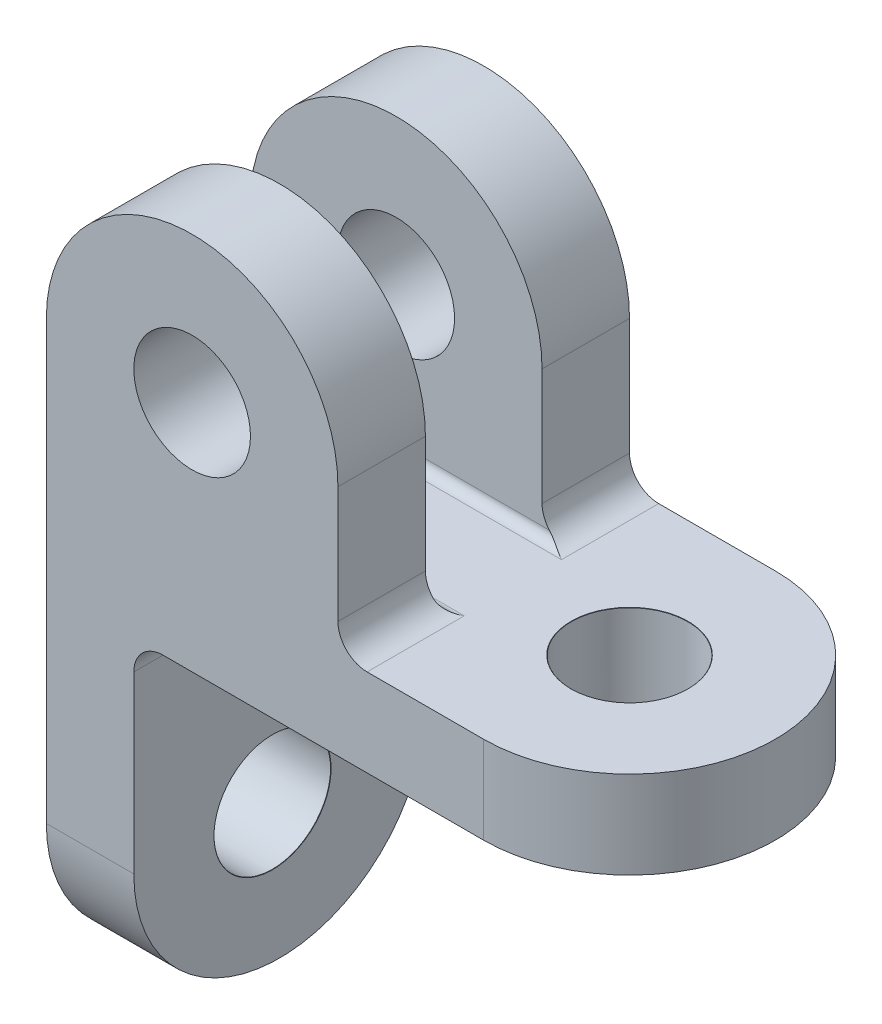
ISO-10303-21;
HEADER;
FILE_DESCRIPTION(('STEP AP214'),'2;1');
FILE_NAME('part.step','',(''),(''),'','','');
FILE_SCHEMA(('AUTOMOTIVE_DESIGN { 1 0 10303 214 1 1 1 1 }'));
ENDSEC;
DATA;
#1=APPLICATION_CONTEXT('core data for automotive mechanical design processes');
#2=APPLICATION_PROTOCOL_DEFINITION('international standard','automotive_design',2000,#1);
#3=PRODUCT_CONTEXT('',#1,'mechanical');
#4=PRODUCT('Part','Part','',(#3));
#5=PRODUCT_RELATED_PRODUCT_CATEGORY('part','',(#4));
#6=PRODUCT_DEFINITION_FORMATION('','',#4);
#7=PRODUCT_DEFINITION_CONTEXT('part definition',#1,'design');
#8=PRODUCT_DEFINITION('design','',#6,#7);
#9=PRODUCT_DEFINITION_SHAPE('','',#8);
#10=(LENGTH_UNIT() NAMED_UNIT(*) SI_UNIT(.MILLI.,.METRE.));
#11=(NAMED_UNIT(*) PLANE_ANGLE_UNIT() SI_UNIT($,.RADIAN.));
#12=(NAMED_UNIT(*) SI_UNIT($,.STERADIAN.) SOLID_ANGLE_UNIT());
#13=UNCERTAINTY_MEASURE_WITH_UNIT(LENGTH_MEASURE(1.E-05),#10,'distance_accuracy_value','');
#14=(GEOMETRIC_REPRESENTATION_CONTEXT(3) GLOBAL_UNCERTAINTY_ASSIGNED_CONTEXT((#13)) GLOBAL_UNIT_ASSIGNED_CONTEXT((#10,
#11,#12)) REPRESENTATION_CONTEXT('',''));
#15=CARTESIAN_POINT('',(0.,0.,0.));
#16=DIRECTION('',(0.,0.,1.));
#17=DIRECTION('',(1.,0.,0.));
#18=AXIS2_PLACEMENT_3D('',#15,#16,#17);
#19=CARTESIAN_POINT('',(0.,15.,0.));
#20=DIRECTION('',(-1.,0.,0.));
#21=DIRECTION('',(0.,-1.,0.));
#22=AXIS2_PLACEMENT_3D('',#19,#20,#21);
#23=CYLINDRICAL_SURFACE('',#22,15.);
#24=DIRECTION('',(-1.,0.,0.));
#25=VECTOR('',#24,1.);
#26=CARTESIAN_POINT('',(0.,15.,15.));
#27=LINE('',#26,#25);
#28=CARTESIAN_POINT('',(0.,15.,15.));
#29=VERTEX_POINT('',#28);
#30=CARTESIAN_POINT('',(9.,15.,15.));
#31=VERTEX_POINT('',#30);
#32=EDGE_CURVE('E257',#29,#31,#27,.F.);
#33=ORIENTED_EDGE('',*,*,#32,.F.);
#34=CARTESIAN_POINT('',(0.,15.,0.));
#35=DIRECTION('',(-1.,0.,0.));
#36=DIRECTION('',(0.,0.,1.));
#37=AXIS2_PLACEMENT_3D('',#34,#35,#36);
#38=CIRCLE('',#37,15.);
#39=CARTESIAN_POINT('',(0.,15.,-15.));
#40=VERTEX_POINT('',#39);
#41=EDGE_CURVE('E261',#40,#29,#38,.T.);
#42=ORIENTED_EDGE('',*,*,#41,.F.);
#43=DIRECTION('',(1.,0.,0.));
#44=VECTOR('',#43,1.);
#45=CARTESIAN_POINT('',(0.,15.,-15.));
#46=LINE('',#45,#44);
#47=CARTESIAN_POINT('',(9.,15.,-15.));
#48=VERTEX_POINT('',#47);
#49=EDGE_CURVE('E172',#48,#40,#46,.F.);
#50=ORIENTED_EDGE('',*,*,#49,.F.);
#51=CARTESIAN_POINT('',(9.,15.,0.));
#52=DIRECTION('',(1.,0.,0.));
#53=DIRECTION('',(0.,0.,-1.));
#54=AXIS2_PLACEMENT_3D('',#51,#52,#53);
#55=CIRCLE('',#54,15.);
#56=EDGE_CURVE('E263',#31,#48,#55,.T.);
#57=ORIENTED_EDGE('',*,*,#56,.F.);
#58=EDGE_LOOP('',(#33,#42,#50,#57));
#59=FACE_BOUND('',#58,.T.);
#60=ADVANCED_FACE('F37',(#59),#23,.T.);
#61=CARTESIAN_POINT('',(45.,36.,0.));
#62=DIRECTION('',(0.,-1.,0.));
#63=DIRECTION('',(0.,0.,-1.));
#64=AXIS2_PLACEMENT_3D('',#61,#62,#63);
#65=CYLINDRICAL_SURFACE('',#64,15.);
#66=DIRECTION('',(0.,-1.,0.));
#67=VECTOR('',#66,1.);
#68=CARTESIAN_POINT('',(45.,0.,15.));
#69=LINE('',#68,#67);
#70=CARTESIAN_POINT('',(45.,36.,15.));
#71=VERTEX_POINT('',#70);
#72=CARTESIAN_POINT('',(45.,45.,15.));
#73=VERTEX_POINT('',#72);
#74=EDGE_CURVE('E246',#71,#73,#69,.F.);
#75=ORIENTED_EDGE('',*,*,#74,.F.);
#76=CARTESIAN_POINT('',(45.,36.,0.));
#77=DIRECTION('',(0.,-1.,0.));
#78=DIRECTION('',(1.,0.,0.));
#79=AXIS2_PLACEMENT_3D('',#76,#77,#78);
#80=CIRCLE('',#79,15.);
#81=CARTESIAN_POINT('',(45.,36.,-15.));
#82=VERTEX_POINT('',#81);
#83=EDGE_CURVE('E252',#82,#71,#80,.T.);
#84=ORIENTED_EDGE('',*,*,#83,.F.);
#85=DIRECTION('',(0.,1.,0.));
#86=VECTOR('',#85,1.);
#87=CARTESIAN_POINT('',(45.,36.,-15.));
#88=LINE('',#87,#86);
#89=CARTESIAN_POINT('',(45.,45.,-15.));
#90=VERTEX_POINT('',#89);
#91=EDGE_CURVE('E249',#90,#82,#88,.F.);
#92=ORIENTED_EDGE('',*,*,#91,.F.);
#93=CARTESIAN_POINT('',(45.,45.,0.));
#94=DIRECTION('',(0.,1.,0.));
#95=DIRECTION('',(0.,0.,1.));
#96=AXIS2_PLACEMENT_3D('',#93,#94,#95);
#97=CIRCLE('',#96,15.);
#98=EDGE_CURVE('E254',#73,#90,#97,.T.);
#99=ORIENTED_EDGE('',*,*,#98,.F.);
#100=EDGE_LOOP('',(#75,#84,#92,#99));
#101=FACE_BOUND('',#100,.T.);
#102=ADVANCED_FACE('F333',(#101),#65,.T.);
#103=CARTESIAN_POINT('',(0.,45.,15.));
#104=DIRECTION('',(0.,1.,0.));
#105=DIRECTION('',(0.,0.,1.));
#106=AXIS2_PLACEMENT_3D('',#103,#104,#105);
#107=PLANE('',#106);
#108=CARTESIAN_POINT('',(45.,45.,0.));
#109=DIRECTION('',(0.,1.,0.));
#110=DIRECTION('',(0.,0.,1.));
#111=AXIS2_PLACEMENT_3D('',#108,#109,#110);
#112=CIRCLE('',#111,6.025);
#113=CARTESIAN_POINT('',(45.,45.,6.025));
#114=VERTEX_POINT('',#113);
#115=EDGE_CURVE('E420',#114,#114,#112,.T.);
#116=ORIENTED_EDGE('',*,*,#115,.F.);
#117=EDGE_LOOP('',(#116));
#118=FACE_BOUND('',#117,.T.);
#119=DIRECTION('',(0.,0.,-1.));
#120=VECTOR('',#119,1.);
#121=CARTESIAN_POINT('',(0.,45.,15.));
#122=LINE('',#121,#120);
#123=CARTESIAN_POINT('',(0.,45.,5.));
#124=VERTEX_POINT('',#123);
#125=CARTESIAN_POINT('',(0.,45.,-5.));
#126=VERTEX_POINT('',#125);
#127=EDGE_CURVE('E241',#124,#126,#122,.T.);
#128=ORIENTED_EDGE('',*,*,#127,.F.);
#129=DIRECTION('',(-1.,0.,0.));
#130=VECTOR('',#129,1.);
#131=CARTESIAN_POINT('',(0.,45.,5.));
#132=LINE('',#131,#130);
#133=CARTESIAN_POINT('',(33.,45.,5.));
#134=VERTEX_POINT('',#133);
#135=EDGE_CURVE('E299',#124,#134,#132,.F.);
#136=ORIENTED_EDGE('',*,*,#135,.T.);
#137=DIRECTION('',(0.,0.,-1.));
#138=VECTOR('',#137,1.);
#139=CARTESIAN_POINT('',(33.,45.,15.));
#140=LINE('',#139,#138);
#141=CARTESIAN_POINT('',(33.,45.,15.));
#142=VERTEX_POINT('',#141);
#143=EDGE_CURVE('E275',#134,#142,#140,.F.);
#144=ORIENTED_EDGE('',*,*,#143,.T.);
#145=DIRECTION('',(1.,0.,0.));
#146=VECTOR('',#145,1.);
#147=CARTESIAN_POINT('',(0.,45.,15.));
#148=LINE('',#147,#146);
#149=EDGE_CURVE('E231',#142,#73,#148,.T.);
#150=ORIENTED_EDGE('',*,*,#149,.T.);
#151=ORIENTED_EDGE('',*,*,#98,.T.);
#152=DIRECTION('',(1.,0.,0.));
#153=VECTOR('',#152,1.);
#154=CARTESIAN_POINT('',(0.,45.,-15.));
#155=LINE('',#154,#153);
#156=CARTESIAN_POINT('',(33.,45.,-15.));
#157=VERTEX_POINT('',#156);
#158=EDGE_CURVE('E174',#157,#90,#155,.T.);
#159=ORIENTED_EDGE('',*,*,#158,.F.);
#160=DIRECTION('',(0.,0.,1.));
#161=VECTOR('',#160,1.);
#162=CARTESIAN_POINT('',(33.,45.,15.));
#163=LINE('',#162,#161);
#164=CARTESIAN_POINT('',(33.,45.,-5.));
#165=VERTEX_POINT('',#164);
#166=EDGE_CURVE('E277',#157,#165,#163,.T.);
#167=ORIENTED_EDGE('',*,*,#166,.T.);
#168=DIRECTION('',(-1.,0.,0.));
#169=VECTOR('',#168,1.);
#170=CARTESIAN_POINT('',(0.,45.,-5.));
#171=LINE('',#170,#169);
#172=EDGE_CURVE('E296',#165,#126,#171,.T.);
#173=ORIENTED_EDGE('',*,*,#172,.T.);
#174=EDGE_LOOP('',(#128,#136,#144,#150,#151,#159,#167,#173));
#175=FACE_BOUND('',#174,.T.);
#176=ADVANCED_FACE('F339',(#118,#175),#107,.T.);
#177=CARTESIAN_POINT('',(0.,0.,15.));
#178=DIRECTION('',(-1.,0.,0.));
#179=DIRECTION('',(0.,0.,1.));
#180=AXIS2_PLACEMENT_3D('',#177,#178,#179);
#181=PLANE('',#180);
#182=CARTESIAN_POINT('',(0.,14.2625637450806,0.728544171249569));
#183=DIRECTION('',(-1.,0.,0.));
#184=DIRECTION('',(0.,0.,1.));
#185=AXIS2_PLACEMENT_3D('',#182,#183,#184);
#186=CIRCLE('',#185,6.);
#187=CARTESIAN_POINT('',(0.,14.2625637450806,6.72854417124957));
#188=VERTEX_POINT('',#187);
#189=EDGE_CURVE('E415',#188,#188,#186,.T.);
#190=ORIENTED_EDGE('',*,*,#189,.F.);
#191=EDGE_LOOP('',(#190));
#192=FACE_BOUND('',#191,.T.);
#193=DIRECTION('',(0.,1.,0.));
#194=VECTOR('',#193,1.);
#195=CARTESIAN_POINT('',(0.,0.,-15.));
#196=LINE('',#195,#194);
#197=CARTESIAN_POINT('',(0.,60.,-15.));
#198=VERTEX_POINT('',#197);
#199=EDGE_CURVE('E162',#40,#198,#196,.T.);
#200=ORIENTED_EDGE('',*,*,#199,.F.);
#201=ORIENTED_EDGE('',*,*,#41,.T.);
#202=DIRECTION('',(0.,1.,0.));
#203=VECTOR('',#202,1.);
#204=CARTESIAN_POINT('',(0.,0.,15.));
#205=LINE('',#204,#203);
#206=CARTESIAN_POINT('',(0.,60.,15.));
#207=VERTEX_POINT('',#206);
#208=EDGE_CURVE('E233',#29,#207,#205,.T.);
#209=ORIENTED_EDGE('',*,*,#208,.T.);
#210=DIRECTION('',(0.,0.,-1.));
#211=VECTOR('',#210,1.);
#212=CARTESIAN_POINT('',(0.,60.,15.));
#213=LINE('',#212,#211);
#214=CARTESIAN_POINT('',(0.,60.,6.));
#215=VERTEX_POINT('',#214);
#216=EDGE_CURVE('E228',#207,#215,#213,.T.);
#217=ORIENTED_EDGE('',*,*,#216,.T.);
#218=DIRECTION('',(0.,1.,0.));
#219=VECTOR('',#218,1.);
#220=CARTESIAN_POINT('',(0.,0.,6.));
#221=LINE('',#220,#219);
#222=CARTESIAN_POINT('',(0.,46.,6.));
#223=VERTEX_POINT('',#222);
#224=EDGE_CURVE('E223',#223,#215,#221,.T.);
#225=ORIENTED_EDGE('',*,*,#224,.F.);
#226=CARTESIAN_POINT('',(0.,46.,5.));
#227=DIRECTION('',(-1.,0.,0.));
#228=DIRECTION('',(0.,0.,1.));
#229=AXIS2_PLACEMENT_3D('',#226,#227,#228);
#230=CIRCLE('',#229,1.);
#231=EDGE_CURVE('E303',#223,#124,#230,.F.);
#232=ORIENTED_EDGE('',*,*,#231,.T.);
#233=ORIENTED_EDGE('',*,*,#127,.T.);
#234=CARTESIAN_POINT('',(0.,46.,-5.));
#235=DIRECTION('',(-1.,0.,0.));
#236=DIRECTION('',(0.,0.,1.));
#237=AXIS2_PLACEMENT_3D('',#234,#235,#236);
#238=CIRCLE('',#237,1.);
#239=CARTESIAN_POINT('',(0.,46.,-6.));
#240=VERTEX_POINT('',#239);
#241=EDGE_CURVE('E51',#126,#240,#238,.F.);
#242=ORIENTED_EDGE('',*,*,#241,.T.);
#243=DIRECTION('',(0.,1.,0.));
#244=VECTOR('',#243,1.);
#245=CARTESIAN_POINT('',(0.,0.,-6.));
#246=LINE('',#245,#244);
#247=CARTESIAN_POINT('',(0.,60.,-6.));
#248=VERTEX_POINT('',#247);
#249=EDGE_CURVE('E179',#240,#248,#246,.T.);
#250=ORIENTED_EDGE('',*,*,#249,.T.);
#251=DIRECTION('',(0.,0.,1.));
#252=VECTOR('',#251,1.);
#253=CARTESIAN_POINT('',(0.,60.,-15.));
#254=LINE('',#253,#252);
#255=EDGE_CURVE('E177',#198,#248,#254,.T.);
#256=ORIENTED_EDGE('',*,*,#255,.F.);
#257=EDGE_LOOP('',(#200,#201,#209,#217,#225,#232,#233,#242,#250,#256));
#258=FACE_BOUND('',#257,.T.);
#259=ADVANCED_FACE('F178',(#192,#258),#181,.T.);
#260=CARTESIAN_POINT('',(9.,0.,15.));
#261=DIRECTION('',(1.,0.,0.));
#262=DIRECTION('',(0.,0.,-1.));
#263=AXIS2_PLACEMENT_3D('',#260,#261,#262);
#264=PLANE('',#263);
#265=CARTESIAN_POINT('',(9.,14.2625637450806,0.728544171249569));
#266=DIRECTION('',(1.,0.,0.));
#267=DIRECTION('',(0.,0.,-1.));
#268=AXIS2_PLACEMENT_3D('',#265,#266,#267);
#269=CIRCLE('',#268,6.025);
#270=CARTESIAN_POINT('',(9.,14.2625637450806,-5.29645582875043));
#271=VERTEX_POINT('',#270);
#272=EDGE_CURVE('E413',#271,#271,#269,.T.);
#273=ORIENTED_EDGE('',*,*,#272,.F.);
#274=EDGE_LOOP('',(#273));
#275=FACE_BOUND('',#274,.T.);
#276=DIRECTION('',(0.,-1.,0.));
#277=VECTOR('',#276,1.);
#278=CARTESIAN_POINT('',(9.,0.,-15.));
#279=LINE('',#278,#277);
#280=CARTESIAN_POINT('',(9.,33.,-15.));
#281=VERTEX_POINT('',#280);
#282=EDGE_CURVE('E173',#281,#48,#279,.T.);
#283=ORIENTED_EDGE('',*,*,#282,.F.);
#284=DIRECTION('',(0.,0.,-1.));
#285=VECTOR('',#284,1.);
#286=CARTESIAN_POINT('',(9.,33.,15.));
#287=LINE('',#286,#285);
#288=CARTESIAN_POINT('',(9.,33.,15.));
#289=VERTEX_POINT('',#288);
#290=EDGE_CURVE('E269',#281,#289,#287,.F.);
#291=ORIENTED_EDGE('',*,*,#290,.T.);
#292=DIRECTION('',(0.,-1.,0.));
#293=VECTOR('',#292,1.);
#294=CARTESIAN_POINT('',(9.,0.,15.));
#295=LINE('',#294,#293);
#296=EDGE_CURVE('E236',#289,#31,#295,.T.);
#297=ORIENTED_EDGE('',*,*,#296,.T.);
#298=ORIENTED_EDGE('',*,*,#56,.T.);
#299=EDGE_LOOP('',(#283,#291,#297,#298));
#300=FACE_BOUND('',#299,.T.);
#301=ADVANCED_FACE('F346',(#275,#300),#264,.T.);
#302=CARTESIAN_POINT('',(0.,36.,15.));
#303=DIRECTION('',(0.,-1.,0.));
#304=DIRECTION('',(1.,0.,0.));
#305=AXIS2_PLACEMENT_3D('',#302,#303,#304);
#306=PLANE('',#305);
#307=CARTESIAN_POINT('',(45.,36.,0.));
#308=DIRECTION('',(0.,-1.,0.));
#309=DIRECTION('',(1.,0.,0.));
#310=AXIS2_PLACEMENT_3D('',#307,#308,#309);
#311=CIRCLE('',#310,5.99999999999999);
#312=CARTESIAN_POINT('',(51.,36.,0.));
#313=VERTEX_POINT('',#312);
#314=EDGE_CURVE('E200',#313,#313,#311,.T.);
#315=ORIENTED_EDGE('',*,*,#314,.F.);
#316=EDGE_LOOP('',(#315));
#317=FACE_BOUND('',#316,.T.);
#318=DIRECTION('',(-1.,0.,0.));
#319=VECTOR('',#318,1.);
#320=CARTESIAN_POINT('',(0.,36.,15.));
#321=LINE('',#320,#319);
#322=CARTESIAN_POINT('',(12.,36.,15.));
#323=VERTEX_POINT('',#322);
#324=EDGE_CURVE('E238',#71,#323,#321,.T.);
#325=ORIENTED_EDGE('',*,*,#324,.T.);
#326=DIRECTION('',(0.,0.,-1.));
#327=VECTOR('',#326,1.);
#328=CARTESIAN_POINT('',(12.,36.,-15.));
#329=LINE('',#328,#327);
#330=CARTESIAN_POINT('',(12.,36.,-15.));
#331=VERTEX_POINT('',#330);
#332=EDGE_CURVE('E266',#323,#331,#329,.T.);
#333=ORIENTED_EDGE('',*,*,#332,.T.);
#334=DIRECTION('',(-1.,0.,0.));
#335=VECTOR('',#334,1.);
#336=CARTESIAN_POINT('',(0.,36.,-15.));
#337=LINE('',#336,#335);
#338=EDGE_CURVE('E234',#82,#331,#337,.T.);
#339=ORIENTED_EDGE('',*,*,#338,.F.);
#340=ORIENTED_EDGE('',*,*,#83,.T.);
#341=EDGE_LOOP('',(#325,#333,#339,#340));
#342=FACE_BOUND('',#341,.T.);
#343=ADVANCED_FACE('F350',(#317,#342),#306,.T.);
#344=CARTESIAN_POINT('',(0.,0.,15.));
#345=DIRECTION('',(0.,0.,1.));
#346=DIRECTION('',(1.,0.,0.));
#347=AXIS2_PLACEMENT_3D('',#344,#345,#346);
#348=PLANE('',#347);
#349=ORIENTED_EDGE('',*,*,#208,.F.);
#350=ORIENTED_EDGE('',*,*,#32,.T.);
#351=ORIENTED_EDGE('',*,*,#296,.F.);
#352=CARTESIAN_POINT('',(12.,33.,15.));
#353=DIRECTION('',(0.,0.,1.));
#354=DIRECTION('',(1.,0.,0.));
#355=AXIS2_PLACEMENT_3D('',#352,#353,#354);
#356=CIRCLE('',#355,3.);
#357=EDGE_CURVE('E273',#289,#323,#356,.F.);
#358=ORIENTED_EDGE('',*,*,#357,.T.);
#359=ORIENTED_EDGE('',*,*,#324,.F.);
#360=ORIENTED_EDGE('',*,*,#74,.T.);
#361=ORIENTED_EDGE('',*,*,#149,.F.);
#362=CARTESIAN_POINT('',(33.,48.,15.));
#363=DIRECTION('',(0.,0.,1.));
#364=DIRECTION('',(1.,0.,0.));
#365=AXIS2_PLACEMENT_3D('',#362,#363,#364);
#366=CIRCLE('',#365,3.);
#367=CARTESIAN_POINT('',(30.,48.,15.));
#368=VERTEX_POINT('',#367);
#369=EDGE_CURVE('E291',#142,#368,#366,.F.);
#370=ORIENTED_EDGE('',*,*,#369,.T.);
#371=DIRECTION('',(0.,-1.,0.));
#372=VECTOR('',#371,1.);
#373=CARTESIAN_POINT('',(30.,0.,15.));
#374=LINE('',#373,#372);
#375=CARTESIAN_POINT('',(30.,60.,15.));
#376=VERTEX_POINT('',#375);
#377=EDGE_CURVE('E214',#376,#368,#374,.T.);
#378=ORIENTED_EDGE('',*,*,#377,.F.);
#379=CARTESIAN_POINT('',(15.,60.,15.));
#380=DIRECTION('',(0.,0.,1.));
#381=DIRECTION('',(1.,0.,0.));
#382=AXIS2_PLACEMENT_3D('',#379,#380,#381);
#383=CIRCLE('',#382,15.);
#384=EDGE_CURVE('E210',#207,#376,#383,.F.);
#385=ORIENTED_EDGE('',*,*,#384,.F.);
#386=EDGE_LOOP('',(#349,#350,#351,#358,#359,#360,#361,#370,#378,#385));
#387=FACE_BOUND('',#386,.T.);
#388=CARTESIAN_POINT('',(15.,60.,15.));
#389=DIRECTION('',(0.,0.,1.));
#390=DIRECTION('',(1.,0.,0.));
#391=AXIS2_PLACEMENT_3D('',#388,#389,#390);
#392=CIRCLE('',#391,6.);
#393=CARTESIAN_POINT('',(21.,60.,15.));
#394=VERTEX_POINT('',#393);
#395=EDGE_CURVE('E207',#394,#394,#392,.T.);
#396=ORIENTED_EDGE('',*,*,#395,.F.);
#397=EDGE_LOOP('',(#396));
#398=FACE_BOUND('',#397,.T.);
#399=ADVANCED_FACE('F354',(#387,#398),#348,.T.);
#400=CARTESIAN_POINT('',(0.,0.,-15.));
#401=DIRECTION('',(0.,0.,1.));
#402=DIRECTION('',(1.,0.,0.));
#403=AXIS2_PLACEMENT_3D('',#400,#401,#402);
#404=PLANE('',#403);
#405=ORIENTED_EDGE('',*,*,#338,.T.);
#406=CARTESIAN_POINT('',(12.,33.,-15.));
#407=DIRECTION('',(0.,0.,1.));
#408=DIRECTION('',(1.,0.,0.));
#409=AXIS2_PLACEMENT_3D('',#406,#407,#408);
#410=CIRCLE('',#409,3.);
#411=EDGE_CURVE('E271',#331,#281,#410,.T.);
#412=ORIENTED_EDGE('',*,*,#411,.T.);
#413=ORIENTED_EDGE('',*,*,#282,.T.);
#414=ORIENTED_EDGE('',*,*,#49,.T.);
#415=ORIENTED_EDGE('',*,*,#199,.T.);
#416=CARTESIAN_POINT('',(15.,60.,-15.));
#417=DIRECTION('',(0.,0.,1.));
#418=DIRECTION('',(1.,0.,0.));
#419=AXIS2_PLACEMENT_3D('',#416,#417,#418);
#420=CIRCLE('',#419,15.);
#421=CARTESIAN_POINT('',(30.,60.,-15.));
#422=VERTEX_POINT('',#421);
#423=EDGE_CURVE('E169',#198,#422,#420,.F.);
#424=ORIENTED_EDGE('',*,*,#423,.T.);
#425=DIRECTION('',(0.,-1.,0.));
#426=VECTOR('',#425,1.);
#427=CARTESIAN_POINT('',(30.,0.,-15.));
#428=LINE('',#427,#426);
#429=CARTESIAN_POINT('',(30.,48.,-15.));
#430=VERTEX_POINT('',#429);
#431=EDGE_CURVE('E184',#422,#430,#428,.T.);
#432=ORIENTED_EDGE('',*,*,#431,.T.);
#433=CARTESIAN_POINT('',(33.,48.,-15.));
#434=DIRECTION('',(0.,0.,1.));
#435=DIRECTION('',(1.,0.,0.));
#436=AXIS2_PLACEMENT_3D('',#433,#434,#435);
#437=CIRCLE('',#436,3.);
#438=EDGE_CURVE('E286',#430,#157,#437,.T.);
#439=ORIENTED_EDGE('',*,*,#438,.T.);
#440=ORIENTED_EDGE('',*,*,#158,.T.);
#441=ORIENTED_EDGE('',*,*,#91,.T.);
#442=EDGE_LOOP('',(#405,#412,#413,#414,#415,#424,#432,#439,#440,#441));
#443=FACE_BOUND('',#442,.T.);
#444=CARTESIAN_POINT('',(15.,60.,-15.));
#445=DIRECTION('',(0.,0.,1.));
#446=DIRECTION('',(1.,0.,0.));
#447=AXIS2_PLACEMENT_3D('',#444,#445,#446);
#448=CIRCLE('',#447,6.);
#449=CARTESIAN_POINT('',(21.,60.,-15.));
#450=VERTEX_POINT('',#449);
#451=EDGE_CURVE('E188',#450,#450,#448,.T.);
#452=ORIENTED_EDGE('',*,*,#451,.T.);
#453=EDGE_LOOP('',(#452));
#454=FACE_BOUND('',#453,.T.);
#455=ADVANCED_FACE('F165',(#443,#454),#404,.F.);
#456=CARTESIAN_POINT('',(15.,60.,15.));
#457=DIRECTION('',(0.,0.,-1.));
#458=DIRECTION('',(-1.,0.,0.));
#459=AXIS2_PLACEMENT_3D('',#456,#457,#458);
#460=CYLINDRICAL_SURFACE('',#459,15.);
#461=CARTESIAN_POINT('',(15.,60.,6.));
#462=DIRECTION('',(0.,0.,1.));
#463=DIRECTION('',(1.,0.,0.));
#464=AXIS2_PLACEMENT_3D('',#461,#462,#463);
#465=CIRCLE('',#464,15.);
#466=CARTESIAN_POINT('',(30.,60.,6.));
#467=VERTEX_POINT('',#466);
#468=EDGE_CURVE('E220',#215,#467,#465,.F.);
#469=ORIENTED_EDGE('',*,*,#468,.F.);
#470=ORIENTED_EDGE('',*,*,#216,.F.);
#471=ORIENTED_EDGE('',*,*,#384,.T.);
#472=DIRECTION('',(0.,0.,-1.));
#473=VECTOR('',#472,1.);
#474=CARTESIAN_POINT('',(30.,60.,15.));
#475=LINE('',#474,#473);
#476=EDGE_CURVE('E217',#376,#467,#475,.T.);
#477=ORIENTED_EDGE('',*,*,#476,.T.);
#478=EDGE_LOOP('',(#469,#470,#471,#477));
#479=FACE_BOUND('',#478,.T.);
#480=ADVANCED_FACE('F358',(#479),#460,.T.);
#481=CARTESIAN_POINT('',(15.,60.,15.));
#482=DIRECTION('',(0.,0.,-1.));
#483=DIRECTION('',(-1.,0.,0.));
#484=AXIS2_PLACEMENT_3D('',#481,#482,#483);
#485=CYLINDRICAL_SURFACE('',#484,6.);
#486=ORIENTED_EDGE('',*,*,#395,.T.);
#487=EDGE_LOOP('',(#486));
#488=FACE_BOUND('',#487,.T.);
#489=CARTESIAN_POINT('',(15.,60.,6.));
#490=DIRECTION('',(0.,0.,1.));
#491=DIRECTION('',(1.,0.,0.));
#492=AXIS2_PLACEMENT_3D('',#489,#490,#491);
#493=CIRCLE('',#492,6.);
#494=CARTESIAN_POINT('',(21.,60.,6.));
#495=VERTEX_POINT('',#494);
#496=EDGE_CURVE('E205',#495,#495,#493,.T.);
#497=ORIENTED_EDGE('',*,*,#496,.F.);
#498=EDGE_LOOP('',(#497));
#499=FACE_BOUND('',#498,.T.);
#500=ADVANCED_FACE('F362',(#488,#499),#485,.F.);
#501=CARTESIAN_POINT('',(30.,0.,15.));
#502=DIRECTION('',(1.,0.,0.));
#503=DIRECTION('',(0.,1.,0.));
#504=AXIS2_PLACEMENT_3D('',#501,#502,#503);
#505=PLANE('',#504);
#506=ORIENTED_EDGE('',*,*,#377,.T.);
#507=DIRECTION('',(0.,0.,-1.));
#508=VECTOR('',#507,1.);
#509=CARTESIAN_POINT('',(30.,48.,6.));
#510=LINE('',#509,#508);
#511=CARTESIAN_POINT('',(30.,48.,6.));
#512=VERTEX_POINT('',#511);
#513=EDGE_CURVE('E281',#368,#512,#510,.T.);
#514=ORIENTED_EDGE('',*,*,#513,.T.);
#515=DIRECTION('',(0.,-1.,0.));
#516=VECTOR('',#515,1.);
#517=CARTESIAN_POINT('',(30.,0.,6.));
#518=LINE('',#517,#516);
#519=EDGE_CURVE('E211',#467,#512,#518,.T.);
#520=ORIENTED_EDGE('',*,*,#519,.F.);
#521=ORIENTED_EDGE('',*,*,#476,.F.);
#522=EDGE_LOOP('',(#506,#514,#520,#521));
#523=FACE_BOUND('',#522,.T.);
#524=ADVANCED_FACE('F365',(#523),#505,.T.);
#525=CARTESIAN_POINT('',(0.,0.,6.));
#526=DIRECTION('',(0.,0.,1.));
#527=DIRECTION('',(1.,0.,0.));
#528=AXIS2_PLACEMENT_3D('',#525,#526,#527);
#529=PLANE('',#528);
#530=ORIENTED_EDGE('',*,*,#496,.T.);
#531=EDGE_LOOP('',(#530));
#532=FACE_BOUND('',#531,.T.);
#533=CARTESIAN_POINT('',(33.,48.,6.));
#534=DIRECTION('',(0.,0.,1.));
#535=DIRECTION('',(1.,0.,0.));
#536=AXIS2_PLACEMENT_3D('',#533,#534,#535);
#537=CIRCLE('',#536,3.);
#538=CARTESIAN_POINT('',(30.7639320225002,46.,6.));
#539=VERTEX_POINT('',#538);
#540=EDGE_CURVE('E288',#512,#539,#537,.T.);
#541=ORIENTED_EDGE('',*,*,#540,.T.);
#542=DIRECTION('',(-1.,0.,0.));
#543=VECTOR('',#542,1.);
#544=CARTESIAN_POINT('',(0.,46.,6.));
#545=LINE('',#544,#543);
#546=EDGE_CURVE('E293',#539,#223,#545,.T.);
#547=ORIENTED_EDGE('',*,*,#546,.T.);
#548=ORIENTED_EDGE('',*,*,#224,.T.);
#549=ORIENTED_EDGE('',*,*,#468,.T.);
#550=ORIENTED_EDGE('',*,*,#519,.T.);
#551=EDGE_LOOP('',(#541,#547,#548,#549,#550));
#552=FACE_BOUND('',#551,.T.);
#553=ADVANCED_FACE('F372',(#532,#552),#529,.F.);
#554=CARTESIAN_POINT('',(15.,60.,-15.));
#555=DIRECTION('',(0.,0.,1.));
#556=DIRECTION('',(1.,0.,0.));
#557=AXIS2_PLACEMENT_3D('',#554,#555,#556);
#558=CYLINDRICAL_SURFACE('',#557,15.);
#559=CARTESIAN_POINT('',(15.,60.,-6.));
#560=DIRECTION('',(0.,0.,1.));
#561=DIRECTION('',(1.,0.,0.));
#562=AXIS2_PLACEMENT_3D('',#559,#560,#561);
#563=CIRCLE('',#562,15.);
#564=CARTESIAN_POINT('',(30.,60.,-6.));
#565=VERTEX_POINT('',#564);
#566=EDGE_CURVE('E199',#248,#565,#563,.F.);
#567=ORIENTED_EDGE('',*,*,#566,.T.);
#568=DIRECTION('',(0.,0.,1.));
#569=VECTOR('',#568,1.);
#570=CARTESIAN_POINT('',(30.,60.,-15.));
#571=LINE('',#570,#569);
#572=EDGE_CURVE('E183',#422,#565,#571,.T.);
#573=ORIENTED_EDGE('',*,*,#572,.F.);
#574=ORIENTED_EDGE('',*,*,#423,.F.);
#575=ORIENTED_EDGE('',*,*,#255,.T.);
#576=EDGE_LOOP('',(#567,#573,#574,#575));
#577=FACE_BOUND('',#576,.T.);
#578=ADVANCED_FACE('F186',(#577),#558,.T.);
#579=CARTESIAN_POINT('',(30.,0.,-15.));
#580=DIRECTION('',(-1.,0.,0.));
#581=DIRECTION('',(0.,-1.,0.));
#582=AXIS2_PLACEMENT_3D('',#579,#580,#581);
#583=PLANE('',#582);
#584=DIRECTION('',(0.,-1.,0.));
#585=VECTOR('',#584,1.);
#586=CARTESIAN_POINT('',(30.,0.,-6.));
#587=LINE('',#586,#585);
#588=CARTESIAN_POINT('',(30.,48.,-6.));
#589=VERTEX_POINT('',#588);
#590=EDGE_CURVE('E192',#565,#589,#587,.T.);
#591=ORIENTED_EDGE('',*,*,#590,.T.);
#592=DIRECTION('',(0.,0.,1.));
#593=VECTOR('',#592,1.);
#594=CARTESIAN_POINT('',(30.,48.,-15.));
#595=LINE('',#594,#593);
#596=EDGE_CURVE('E279',#589,#430,#595,.F.);
#597=ORIENTED_EDGE('',*,*,#596,.T.);
#598=ORIENTED_EDGE('',*,*,#431,.F.);
#599=ORIENTED_EDGE('',*,*,#572,.T.);
#600=EDGE_LOOP('',(#591,#597,#598,#599));
#601=FACE_BOUND('',#600,.T.);
#602=ADVANCED_FACE('F381',(#601),#583,.F.);
#603=CARTESIAN_POINT('',(15.,60.,-15.));
#604=DIRECTION('',(0.,0.,1.));
#605=DIRECTION('',(1.,0.,0.));
#606=AXIS2_PLACEMENT_3D('',#603,#604,#605);
#607=CYLINDRICAL_SURFACE('',#606,6.);
#608=ORIENTED_EDGE('',*,*,#451,.F.);
#609=EDGE_LOOP('',(#608));
#610=FACE_BOUND('',#609,.T.);
#611=CARTESIAN_POINT('',(15.,60.,-6.));
#612=DIRECTION('',(0.,0.,1.));
#613=DIRECTION('',(1.,0.,0.));
#614=AXIS2_PLACEMENT_3D('',#611,#612,#613);
#615=CIRCLE('',#614,6.);
#616=CARTESIAN_POINT('',(21.,60.,-6.));
#617=VERTEX_POINT('',#616);
#618=EDGE_CURVE('E196',#617,#617,#615,.T.);
#619=ORIENTED_EDGE('',*,*,#618,.T.);
#620=EDGE_LOOP('',(#619));
#621=FACE_BOUND('',#620,.T.);
#622=ADVANCED_FACE('F377',(#610,#621),#607,.F.);
#623=CARTESIAN_POINT('',(0.,0.,-6.));
#624=DIRECTION('',(0.,0.,1.));
#625=DIRECTION('',(1.,0.,0.));
#626=AXIS2_PLACEMENT_3D('',#623,#624,#625);
#627=PLANE('',#626);
#628=ORIENTED_EDGE('',*,*,#618,.F.);
#629=EDGE_LOOP('',(#628));
#630=FACE_BOUND('',#629,.T.);
#631=ORIENTED_EDGE('',*,*,#249,.F.);
#632=DIRECTION('',(-1.,0.,0.));
#633=VECTOR('',#632,1.);
#634=CARTESIAN_POINT('',(33.,46.,-6.));
#635=LINE('',#634,#633);
#636=CARTESIAN_POINT('',(30.7639320225002,46.,-6.));
#637=VERTEX_POINT('',#636);
#638=EDGE_CURVE('E58',#240,#637,#635,.F.);
#639=ORIENTED_EDGE('',*,*,#638,.T.);
#640=CARTESIAN_POINT('',(33.,48.,-6.));
#641=DIRECTION('',(0.,0.,1.));
#642=DIRECTION('',(1.,0.,0.));
#643=AXIS2_PLACEMENT_3D('',#640,#641,#642);
#644=CIRCLE('',#643,3.);
#645=EDGE_CURVE('E284',#637,#589,#644,.F.);
#646=ORIENTED_EDGE('',*,*,#645,.T.);
#647=ORIENTED_EDGE('',*,*,#590,.F.);
#648=ORIENTED_EDGE('',*,*,#566,.F.);
#649=EDGE_LOOP('',(#631,#639,#646,#647,#648));
#650=FACE_BOUND('',#649,.T.);
#651=ADVANCED_FACE('F380',(#630,#650),#627,.T.);
#652=CARTESIAN_POINT('',(45.,45.,0.));
#653=DIRECTION('',(0.,1.,0.));
#654=DIRECTION('',(0.,0.,1.));
#655=AXIS2_PLACEMENT_3D('',#652,#653,#654);
#656=CYLINDRICAL_SURFACE('',#655,5.99999999999999);
#657=CARTESIAN_POINT('',(45.,44.975,0.));
#658=DIRECTION('',(0.,1.,0.));
#659=DIRECTION('',(0.,0.,1.));
#660=AXIS2_PLACEMENT_3D('',#657,#658,#659);
#661=CIRCLE('',#660,5.99999999999999);
#662=CARTESIAN_POINT('',(45.,44.975,5.99999999999999));
#663=VERTEX_POINT('',#662);
#664=EDGE_CURVE('E423',#663,#663,#661,.T.);
#665=ORIENTED_EDGE('',*,*,#664,.T.);
#666=EDGE_LOOP('',(#665));
#667=FACE_BOUND('',#666,.T.);
#668=ORIENTED_EDGE('',*,*,#314,.T.);
#669=EDGE_LOOP('',(#668));
#670=FACE_BOUND('',#669,.T.);
#671=ADVANCED_FACE('F390',(#667,#670),#656,.F.);
#672=CARTESIAN_POINT('',(45.,45.,0.));
#673=DIRECTION('',(0.,1.,0.));
#674=DIRECTION('',(0.,0.,1.));
#675=AXIS2_PLACEMENT_3D('',#672,#673,#674);
#676=CONICAL_SURFACE('',#675,6.025,0.785398163397587);
#677=ORIENTED_EDGE('',*,*,#664,.F.);
#678=EDGE_LOOP('',(#677));
#679=FACE_BOUND('',#678,.T.);
#680=ORIENTED_EDGE('',*,*,#115,.T.);
#681=EDGE_LOOP('',(#680));
#682=FACE_BOUND('',#681,.T.);
#683=ADVANCED_FACE('F394',(#679,#682),#676,.F.);
#684=CARTESIAN_POINT('',(9.,14.2625637450806,0.728544171249569));
#685=DIRECTION('',(1.,0.,0.));
#686=DIRECTION('',(0.,0.,-1.));
#687=AXIS2_PLACEMENT_3D('',#684,#685,#686);
#688=CYLINDRICAL_SURFACE('',#687,6.);
#689=CARTESIAN_POINT('',(8.975,14.2625637450806,0.728544171249569));
#690=DIRECTION('',(1.,0.,0.));
#691=DIRECTION('',(0.,0.,-1.));
#692=AXIS2_PLACEMENT_3D('',#689,#690,#691);
#693=CIRCLE('',#692,5.99999999999999);
#694=CARTESIAN_POINT('',(8.975,14.2625637450806,-5.27145582875043));
#695=VERTEX_POINT('',#694);
#696=EDGE_CURVE('E410',#695,#695,#693,.T.);
#697=ORIENTED_EDGE('',*,*,#696,.T.);
#698=EDGE_LOOP('',(#697));
#699=FACE_BOUND('',#698,.T.);
#700=ORIENTED_EDGE('',*,*,#189,.T.);
#701=EDGE_LOOP('',(#700));
#702=FACE_BOUND('',#701,.T.);
#703=ADVANCED_FACE('F398',(#699,#702),#688,.F.);
#704=CARTESIAN_POINT('',(9.,14.2625637450806,0.728544171249569));
#705=DIRECTION('',(1.,0.,0.));
#706=DIRECTION('',(0.,0.,-1.));
#707=AXIS2_PLACEMENT_3D('',#704,#705,#706);
#708=CONICAL_SURFACE('',#707,6.025,0.785398163397448);
#709=ORIENTED_EDGE('',*,*,#696,.F.);
#710=EDGE_LOOP('',(#709));
#711=FACE_BOUND('',#710,.T.);
#712=ORIENTED_EDGE('',*,*,#272,.T.);
#713=EDGE_LOOP('',(#712));
#714=FACE_BOUND('',#713,.T.);
#715=ADVANCED_FACE('F325',(#711,#714),#708,.F.);
#716=CARTESIAN_POINT('',(12.,33.,15.));
#717=DIRECTION('',(0.,0.,1.));
#718=DIRECTION('',(1.,0.,0.));
#719=AXIS2_PLACEMENT_3D('',#716,#717,#718);
#720=CYLINDRICAL_SURFACE('',#719,3.);
#721=ORIENTED_EDGE('',*,*,#357,.F.);
#722=ORIENTED_EDGE('',*,*,#290,.F.);
#723=ORIENTED_EDGE('',*,*,#411,.F.);
#724=ORIENTED_EDGE('',*,*,#332,.F.);
#725=EDGE_LOOP('',(#721,#722,#723,#724));
#726=FACE_BOUND('',#725,.T.);
#727=ADVANCED_FACE('F321',(#726),#720,.F.);
#728=CARTESIAN_POINT('',(33.,48.,15.));
#729=DIRECTION('',(0.,0.,1.));
#730=DIRECTION('',(1.,0.,0.));
#731=AXIS2_PLACEMENT_3D('',#728,#729,#730);
#732=CYLINDRICAL_SURFACE('',#731,3.);
#733=ORIENTED_EDGE('',*,*,#438,.F.);
#734=ORIENTED_EDGE('',*,*,#596,.F.);
#735=ORIENTED_EDGE('',*,*,#645,.F.);
#736=CARTESIAN_POINT('',(30.7639320225002,46.,-6.));
#737=CARTESIAN_POINT('',(30.7922427062925,45.9683421227827,-5.99999544448928));
#738=CARTESIAN_POINT('',(30.8212114183646,45.937312555623,-5.99849736947903));
#739=CARTESIAN_POINT('',(30.8802725837931,45.8766678274943,-5.99283301481519));
#740=CARTESIAN_POINT('',(30.9103635620076,45.847050918864,-5.98867012902469));
#741=CARTESIAN_POINT('',(31.0016798526505,45.7608737257337,-5.97273576819055));
#742=CARTESIAN_POINT('',(31.064381164975,45.7065051528933,-5.95750869079421));
#743=CARTESIAN_POINT('',(31.2348554984626,45.5704386427709,-5.907562982182));
#744=CARTESIAN_POINT('',(31.3451740545039,45.4942553669027,-5.86661117528772));
#745=CARTESIAN_POINT('',(31.5712276371182,45.3587627220768,-5.7718126940861));
#746=CARTESIAN_POINT('',(31.6869922740856,45.2995620859109,-5.71788682166599));
#747=CARTESIAN_POINT('',(31.8877148332858,45.2123310760532,-5.61854092667534));
#748=CARTESIAN_POINT('',(31.9719515325643,45.180233319111,-5.57513874852623));
#749=CARTESIAN_POINT('',(32.1415128808526,45.1240679978524,-5.4853356638848));
#750=CARTESIAN_POINT('',(32.2268380563294,45.1000044851913,-5.43893325841987));
#751=CARTESIAN_POINT('',(32.4834379580259,45.039597092353,-5.2969634194293));
#752=CARTESIAN_POINT('',(32.6559183604885,45.0147897665438,-5.19833398038214));
#753=CARTESIAN_POINT('',(32.8824568927682,45.0018159537015,-5.06785769811339));
#754=CARTESIAN_POINT('',(32.9364812188731,45.0001858337173,-5.03667226481749));
#755=CARTESIAN_POINT('',(32.9936754144974,45.0000050019085,-5.00365150585628));
#756=CARTESIAN_POINT('',(32.9968376938098,45.0000000021803,-5.00182576315349));
#757=CARTESIAN_POINT('',(33.,45.,-5.));
#758=B_SPLINE_CURVE_WITH_KNOTS('',3,(#736,#737,#738,#739,#740,#741,#742,#743,#744,#745,#746,
#747,#748,#749,#750,#751,#752,#753,#754,#755,#756,#757),.UNSPECIFIED.,.F.,.F.,(4,2,2,2,2,2,2,2,
2,2,4),(0.,0.127328124372166,0.254494407314541,0.506902758847991,0.92515434749421,
1.34602692875663,1.64578712718784,1.94569826663474,2.54344782717996,2.73062158792369,
2.74157604934411),.UNSPECIFIED.);
#759=EDGE_CURVE('E11',#637,#165,#758,.T.);
#760=ORIENTED_EDGE('',*,*,#759,.T.);
#761=ORIENTED_EDGE('',*,*,#166,.F.);
#762=EDGE_LOOP('',(#733,#734,#735,#760,#761));
#763=FACE_BOUND('',#762,.T.);
#764=ADVANCED_FACE('F316',(#763),#732,.F.);
#765=CARTESIAN_POINT('',(33.,48.,15.));
#766=DIRECTION('',(0.,0.,1.));
#767=DIRECTION('',(1.,0.,0.));
#768=AXIS2_PLACEMENT_3D('',#765,#766,#767);
#769=CYLINDRICAL_SURFACE('',#768,3.);
#770=ORIENTED_EDGE('',*,*,#369,.F.);
#771=ORIENTED_EDGE('',*,*,#143,.F.);
#772=CARTESIAN_POINT('',(30.7639320225002,46.,6.));
#773=CARTESIAN_POINT('',(30.7922427062925,45.9683421227827,5.99999544448928));
#774=CARTESIAN_POINT('',(30.8212114183646,45.937312555623,5.99849736947903));
#775=CARTESIAN_POINT('',(30.8802725837931,45.8766678274943,5.99283301481519));
#776=CARTESIAN_POINT('',(30.9103635620076,45.847050918864,5.98867012902469));
#777=CARTESIAN_POINT('',(31.0016798526505,45.7608737257337,5.97273576819055));
#778=CARTESIAN_POINT('',(31.064381164975,45.7065051528933,5.9575086907942));
#779=CARTESIAN_POINT('',(31.2348554984626,45.5704386427709,5.907562982182));
#780=CARTESIAN_POINT('',(31.3451740545039,45.4942553669027,5.86661117528772));
#781=CARTESIAN_POINT('',(31.5712276371182,45.3587627220768,5.7718126940861));
#782=CARTESIAN_POINT('',(31.6869922740856,45.2995620859109,5.71788682166599));
#783=CARTESIAN_POINT('',(31.8877148332858,45.2123310760532,5.61854092667534));
#784=CARTESIAN_POINT('',(31.9719515325643,45.180233319111,5.57513874852622));
#785=CARTESIAN_POINT('',(32.1415128808526,45.1240679978524,5.4853356638848));
#786=CARTESIAN_POINT('',(32.2268380563294,45.1000044851913,5.43893325841987));
#787=CARTESIAN_POINT('',(32.4834379580259,45.039597092353,5.2969634194293));
#788=CARTESIAN_POINT('',(32.6559183604885,45.0147897665438,5.19833398038214));
#789=CARTESIAN_POINT('',(32.8824568927682,45.0018159537015,5.06785769811339));
#790=CARTESIAN_POINT('',(32.9364812188731,45.0001858337173,5.03667226481749));
#791=CARTESIAN_POINT('',(32.9936754144974,45.0000050019085,5.00365150585628));
#792=CARTESIAN_POINT('',(32.9968376938098,45.0000000021803,5.00182576315349));
#793=CARTESIAN_POINT('',(33.,45.,5.));
#794=B_SPLINE_CURVE_WITH_KNOTS('',3,(#772,#773,#774,#775,#776,#777,#778,#779,#780,#781,#782,
#783,#784,#785,#786,#787,#788,#789,#790,#791,#792,#793),.UNSPECIFIED.,.F.,.F.,(4,2,2,2,2,2,2,2,
2,2,4),(0.,0.127328124372166,0.254494407314533,0.506902758847991,0.92515434749421,
1.34602692875663,1.64578712718784,1.94569826663474,2.54344782717996,2.73062158792369,
2.7415760493441),.UNSPECIFIED.);
#795=EDGE_CURVE('E305',#134,#539,#794,.F.);
#796=ORIENTED_EDGE('',*,*,#795,.T.);
#797=ORIENTED_EDGE('',*,*,#540,.F.);
#798=ORIENTED_EDGE('',*,*,#513,.F.);
#799=EDGE_LOOP('',(#770,#771,#796,#797,#798));
#800=FACE_BOUND('',#799,.T.);
#801=ADVANCED_FACE('F313',(#800),#769,.F.);
#802=CARTESIAN_POINT('',(0.,46.,5.));
#803=DIRECTION('',(-1.,0.,0.));
#804=DIRECTION('',(0.,0.,1.));
#805=AXIS2_PLACEMENT_3D('',#802,#803,#804);
#806=CYLINDRICAL_SURFACE('',#805,1.);
#807=ORIENTED_EDGE('',*,*,#795,.F.);
#808=ORIENTED_EDGE('',*,*,#135,.F.);
#809=ORIENTED_EDGE('',*,*,#231,.F.);
#810=ORIENTED_EDGE('',*,*,#546,.F.);
#811=EDGE_LOOP('',(#807,#808,#809,#810));
#812=FACE_BOUND('',#811,.T.);
#813=ADVANCED_FACE('F311',(#812),#806,.F.);
#814=CARTESIAN_POINT('',(0.,46.,-5.));
#815=DIRECTION('',(1.,0.,0.));
#816=DIRECTION('',(0.,0.,-1.));
#817=AXIS2_PLACEMENT_3D('',#814,#815,#816);
#818=CYLINDRICAL_SURFACE('',#817,1.);
#819=ORIENTED_EDGE('',*,*,#759,.F.);
#820=ORIENTED_EDGE('',*,*,#638,.F.);
#821=ORIENTED_EDGE('',*,*,#241,.F.);
#822=ORIENTED_EDGE('',*,*,#172,.F.);
#823=EDGE_LOOP('',(#819,#820,#821,#822));
#824=FACE_BOUND('',#823,.T.);
#825=ADVANCED_FACE('F39',(#824),#818,.F.);
#826=CLOSED_SHELL('',(#60,#102,#176,#259,#301,#343,#399,#455,#480,#500,#524,#553,#578,#602,#622,
#651,#671,#683,#703,#715,#727,#764,#801,#813,#825));
#827=MANIFOLD_SOLID_BREP('B2',#826);
#828=ADVANCED_BREP_SHAPE_REPRESENTATION('',(#18,#827),#14);
#829=SHAPE_DEFINITION_REPRESENTATION(#9,#828);
ENDSEC;
END-ISO-10303-21;
